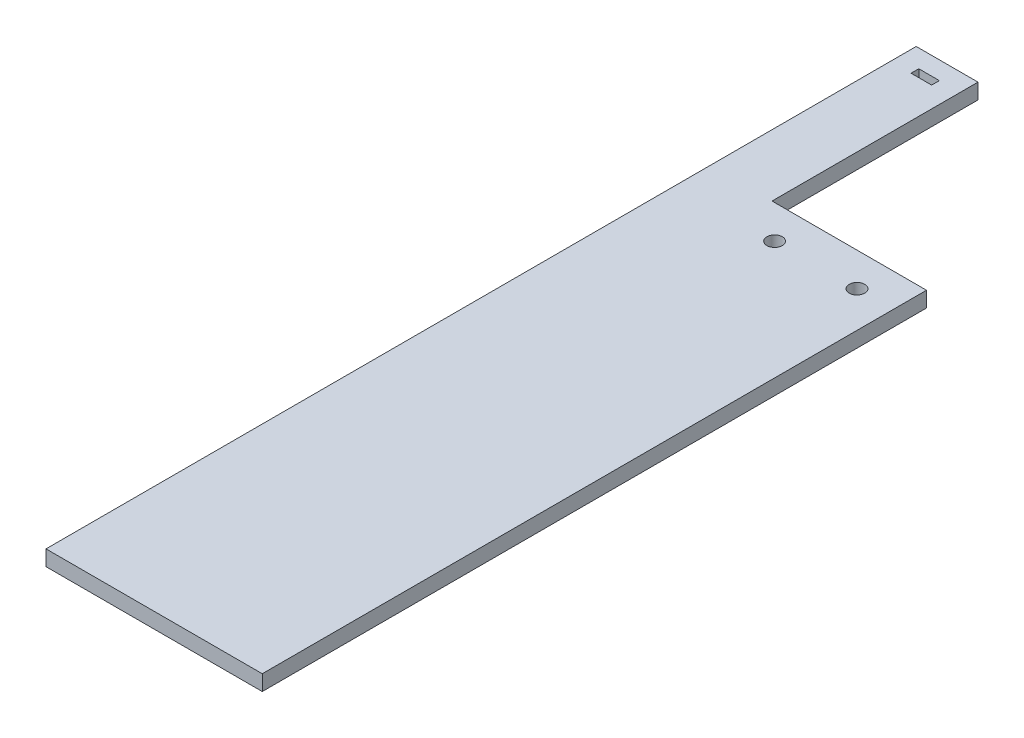
ISO-10303-21;
HEADER;
FILE_DESCRIPTION(('STEP AP214'),'2;1');
FILE_NAME('part.step','',(''),(''),'','','');
FILE_SCHEMA(('AUTOMOTIVE_DESIGN { 1 0 10303 214 1 1 1 1 }'));
ENDSEC;
DATA;
#1=APPLICATION_CONTEXT('core data for automotive mechanical design processes');
#2=APPLICATION_PROTOCOL_DEFINITION('international standard','automotive_design',2000,#1);
#3=PRODUCT_CONTEXT('',#1,'mechanical');
#4=PRODUCT('Part','Part','',(#3));
#5=PRODUCT_RELATED_PRODUCT_CATEGORY('part','',(#4));
#6=PRODUCT_DEFINITION_FORMATION('','',#4);
#7=PRODUCT_DEFINITION_CONTEXT('part definition',#1,'design');
#8=PRODUCT_DEFINITION('design','',#6,#7);
#9=PRODUCT_DEFINITION_SHAPE('','',#8);
#10=(LENGTH_UNIT() NAMED_UNIT(*) SI_UNIT(.MILLI.,.METRE.));
#11=(NAMED_UNIT(*) PLANE_ANGLE_UNIT() SI_UNIT($,.RADIAN.));
#12=(NAMED_UNIT(*) SI_UNIT($,.STERADIAN.) SOLID_ANGLE_UNIT());
#13=UNCERTAINTY_MEASURE_WITH_UNIT(LENGTH_MEASURE(1.E-05),#10,'distance_accuracy_value','');
#14=(GEOMETRIC_REPRESENTATION_CONTEXT(3) GLOBAL_UNCERTAINTY_ASSIGNED_CONTEXT((#13)) GLOBAL_UNIT_ASSIGNED_CONTEXT((#10,
#11,#12)) REPRESENTATION_CONTEXT('',''));
#15=CARTESIAN_POINT('',(0.,0.,0.));
#16=DIRECTION('',(0.,0.,1.));
#17=DIRECTION('',(1.,0.,0.));
#18=AXIS2_PLACEMENT_3D('',#15,#16,#17);
#19=CARTESIAN_POINT('',(0.,3.,0.));
#20=DIRECTION('',(0.,-1.,0.));
#21=DIRECTION('',(0.,0.,-1.));
#22=AXIS2_PLACEMENT_3D('',#19,#20,#21);
#23=PLANE('',#22);
#24=CARTESIAN_POINT('',(19.,3.,-122.5));
#25=DIRECTION('',(0.,1.,0.));
#26=DIRECTION('',(0.,0.,1.));
#27=AXIS2_PLACEMENT_3D('',#24,#25,#26);
#28=CIRCLE('',#27,1.5);
#29=CARTESIAN_POINT('',(19.,3.,-121.));
#30=VERTEX_POINT('',#29);
#31=EDGE_CURVE('E174',#30,#30,#28,.T.);
#32=ORIENTED_EDGE('',*,*,#31,.F.);
#33=EDGE_LOOP('',(#32));
#34=FACE_BOUND('',#33,.T.);
#35=DIRECTION('',(0.,0.,1.));
#36=VECTOR('',#35,1.);
#37=CARTESIAN_POINT('',(0.,3.,0.));
#38=LINE('',#37,#36);
#39=CARTESIAN_POINT('',(0.,3.,-169.));
#40=VERTEX_POINT('',#39);
#41=CARTESIAN_POINT('',(0.,3.,0.));
#42=VERTEX_POINT('',#41);
#43=EDGE_CURVE('E182',#40,#42,#38,.T.);
#44=ORIENTED_EDGE('',*,*,#43,.T.);
#45=DIRECTION('',(1.,0.,0.));
#46=VECTOR('',#45,1.);
#47=CARTESIAN_POINT('',(0.,3.,0.));
#48=LINE('',#47,#46);
#49=CARTESIAN_POINT('',(42.,3.,0.));
#50=VERTEX_POINT('',#49);
#51=EDGE_CURVE('E186',#42,#50,#48,.T.);
#52=ORIENTED_EDGE('',*,*,#51,.T.);
#53=DIRECTION('',(0.,0.,-1.));
#54=VECTOR('',#53,1.);
#55=CARTESIAN_POINT('',(42.,3.,0.));
#56=LINE('',#55,#54);
#57=CARTESIAN_POINT('',(42.,3.,-129.));
#58=VERTEX_POINT('',#57);
#59=EDGE_CURVE('E190',#50,#58,#56,.T.);
#60=ORIENTED_EDGE('',*,*,#59,.T.);
#61=DIRECTION('',(-1.,0.,0.));
#62=VECTOR('',#61,1.);
#63=CARTESIAN_POINT('',(12.,3.,-129.));
#64=LINE('',#63,#62);
#65=CARTESIAN_POINT('',(12.,3.,-129.));
#66=VERTEX_POINT('',#65);
#67=EDGE_CURVE('E193',#58,#66,#64,.T.);
#68=ORIENTED_EDGE('',*,*,#67,.T.);
#69=DIRECTION('',(0.,0.,-1.));
#70=VECTOR('',#69,1.);
#71=CARTESIAN_POINT('',(12.,3.,-169.));
#72=LINE('',#71,#70);
#73=CARTESIAN_POINT('',(12.,3.,-169.));
#74=VERTEX_POINT('',#73);
#75=EDGE_CURVE('E196',#66,#74,#72,.T.);
#76=ORIENTED_EDGE('',*,*,#75,.T.);
#77=DIRECTION('',(-1.,0.,0.));
#78=VECTOR('',#77,1.);
#79=CARTESIAN_POINT('',(0.,3.,-169.));
#80=LINE('',#79,#78);
#81=EDGE_CURVE('E199',#74,#40,#80,.T.);
#82=ORIENTED_EDGE('',*,*,#81,.T.);
#83=EDGE_LOOP('',(#44,#52,#60,#68,#76,#82));
#84=FACE_BOUND('',#83,.T.);
#85=DIRECTION('',(0.,0.,1.));
#86=VECTOR('',#85,1.);
#87=CARTESIAN_POINT('',(4.,3.,-165.5));
#88=LINE('',#87,#86);
#89=CARTESIAN_POINT('',(4.,3.,-165.5));
#90=VERTEX_POINT('',#89);
#91=CARTESIAN_POINT('',(4.,3.,-164.));
#92=VERTEX_POINT('',#91);
#93=EDGE_CURVE('E123',#90,#92,#88,.T.);
#94=ORIENTED_EDGE('',*,*,#93,.F.);
#95=DIRECTION('',(-1.,0.,0.));
#96=VECTOR('',#95,1.);
#97=CARTESIAN_POINT('',(4.,3.,-165.5));
#98=LINE('',#97,#96);
#99=CARTESIAN_POINT('',(8.,3.,-165.5));
#100=VERTEX_POINT('',#99);
#101=EDGE_CURVE('E150',#100,#90,#98,.T.);
#102=ORIENTED_EDGE('',*,*,#101,.F.);
#103=DIRECTION('',(0.,0.,-1.));
#104=VECTOR('',#103,1.);
#105=CARTESIAN_POINT('',(8.,3.,-165.5));
#106=LINE('',#105,#104);
#107=CARTESIAN_POINT('',(8.,3.,-164.));
#108=VERTEX_POINT('',#107);
#109=EDGE_CURVE('E146',#108,#100,#106,.T.);
#110=ORIENTED_EDGE('',*,*,#109,.F.);
#111=DIRECTION('',(1.,0.,0.));
#112=VECTOR('',#111,1.);
#113=CARTESIAN_POINT('',(4.,3.,-164.));
#114=LINE('',#113,#112);
#115=EDGE_CURVE('E132',#92,#108,#114,.T.);
#116=ORIENTED_EDGE('',*,*,#115,.F.);
#117=EDGE_LOOP('',(#94,#102,#110,#116));
#118=FACE_BOUND('',#117,.T.);
#119=CARTESIAN_POINT('',(35.,3.,-122.5));
#120=DIRECTION('',(0.,1.,0.));
#121=DIRECTION('',(0.,0.,1.));
#122=AXIS2_PLACEMENT_3D('',#119,#120,#121);
#123=CIRCLE('',#122,1.5);
#124=CARTESIAN_POINT('',(35.,3.,-121.));
#125=VERTEX_POINT('',#124);
#126=EDGE_CURVE('E158',#125,#125,#123,.T.);
#127=ORIENTED_EDGE('',*,*,#126,.F.);
#128=EDGE_LOOP('',(#127));
#129=FACE_BOUND('',#128,.T.);
#130=ADVANCED_FACE('F45',(#34,#84,#118,#129),#23,.F.);
#131=CARTESIAN_POINT('',(0.,0.,0.));
#132=DIRECTION('',(0.,-1.,0.));
#133=DIRECTION('',(0.,0.,-1.));
#134=AXIS2_PLACEMENT_3D('',#131,#132,#133);
#135=PLANE('',#134);
#136=DIRECTION('',(-1.,0.,0.));
#137=VECTOR('',#136,1.);
#138=CARTESIAN_POINT('',(4.,0.,-165.5));
#139=LINE('',#138,#137);
#140=CARTESIAN_POINT('',(8.,0.,-165.5));
#141=VERTEX_POINT('',#140);
#142=CARTESIAN_POINT('',(4.,0.,-165.5));
#143=VERTEX_POINT('',#142);
#144=EDGE_CURVE('E133',#141,#143,#139,.T.);
#145=ORIENTED_EDGE('',*,*,#144,.T.);
#146=DIRECTION('',(0.,0.,1.));
#147=VECTOR('',#146,1.);
#148=CARTESIAN_POINT('',(4.,0.,-165.5));
#149=LINE('',#148,#147);
#150=CARTESIAN_POINT('',(4.,0.,-164.));
#151=VERTEX_POINT('',#150);
#152=EDGE_CURVE('E69',#143,#151,#149,.T.);
#153=ORIENTED_EDGE('',*,*,#152,.T.);
#154=DIRECTION('',(1.,0.,0.));
#155=VECTOR('',#154,1.);
#156=CARTESIAN_POINT('',(4.,0.,-164.));
#157=LINE('',#156,#155);
#158=CARTESIAN_POINT('',(8.,0.,-164.));
#159=VERTEX_POINT('',#158);
#160=EDGE_CURVE('E139',#151,#159,#157,.T.);
#161=ORIENTED_EDGE('',*,*,#160,.T.);
#162=DIRECTION('',(0.,0.,-1.));
#163=VECTOR('',#162,1.);
#164=CARTESIAN_POINT('',(8.,0.,-165.5));
#165=LINE('',#164,#163);
#166=EDGE_CURVE('E161',#159,#141,#165,.T.);
#167=ORIENTED_EDGE('',*,*,#166,.T.);
#168=EDGE_LOOP('',(#145,#153,#161,#167));
#169=FACE_BOUND('',#168,.T.);
#170=CARTESIAN_POINT('',(19.,0.,-122.5));
#171=DIRECTION('',(0.,1.,0.));
#172=DIRECTION('',(0.,0.,1.));
#173=AXIS2_PLACEMENT_3D('',#170,#171,#172);
#174=CIRCLE('',#173,1.5);
#175=CARTESIAN_POINT('',(19.,0.,-121.));
#176=VERTEX_POINT('',#175);
#177=EDGE_CURVE('E141',#176,#176,#174,.T.);
#178=ORIENTED_EDGE('',*,*,#177,.T.);
#179=EDGE_LOOP('',(#178));
#180=FACE_BOUND('',#179,.T.);
#181=DIRECTION('',(1.,0.,0.));
#182=VECTOR('',#181,1.);
#183=CARTESIAN_POINT('',(0.,0.,0.));
#184=LINE('',#183,#182);
#185=CARTESIAN_POINT('',(0.,0.,0.));
#186=VERTEX_POINT('',#185);
#187=CARTESIAN_POINT('',(42.,0.,0.));
#188=VERTEX_POINT('',#187);
#189=EDGE_CURVE('E178',#186,#188,#184,.T.);
#190=ORIENTED_EDGE('',*,*,#189,.F.);
#191=DIRECTION('',(0.,0.,1.));
#192=VECTOR('',#191,1.);
#193=CARTESIAN_POINT('',(0.,0.,-129.));
#194=LINE('',#193,#192);
#195=CARTESIAN_POINT('',(0.,0.,-169.));
#196=VERTEX_POINT('',#195);
#197=EDGE_CURVE('E187',#196,#186,#194,.T.);
#198=ORIENTED_EDGE('',*,*,#197,.F.);
#199=DIRECTION('',(-1.,0.,0.));
#200=VECTOR('',#199,1.);
#201=CARTESIAN_POINT('',(0.,0.,-169.));
#202=LINE('',#201,#200);
#203=CARTESIAN_POINT('',(12.,0.,-169.));
#204=VERTEX_POINT('',#203);
#205=EDGE_CURVE('E215',#204,#196,#202,.T.);
#206=ORIENTED_EDGE('',*,*,#205,.F.);
#207=DIRECTION('',(0.,0.,-1.));
#208=VECTOR('',#207,1.);
#209=CARTESIAN_POINT('',(12.,0.,-169.));
#210=LINE('',#209,#208);
#211=CARTESIAN_POINT('',(12.,0.,-129.));
#212=VERTEX_POINT('',#211);
#213=EDGE_CURVE('E212',#212,#204,#210,.T.);
#214=ORIENTED_EDGE('',*,*,#213,.F.);
#215=DIRECTION('',(-1.,0.,0.));
#216=VECTOR('',#215,1.);
#217=CARTESIAN_POINT('',(12.,0.,-129.));
#218=LINE('',#217,#216);
#219=CARTESIAN_POINT('',(42.,0.,-129.));
#220=VERTEX_POINT('',#219);
#221=EDGE_CURVE('E209',#220,#212,#218,.T.);
#222=ORIENTED_EDGE('',*,*,#221,.F.);
#223=DIRECTION('',(0.,0.,-1.));
#224=VECTOR('',#223,1.);
#225=CARTESIAN_POINT('',(42.,0.,0.));
#226=LINE('',#225,#224);
#227=EDGE_CURVE('E206',#188,#220,#226,.T.);
#228=ORIENTED_EDGE('',*,*,#227,.F.);
#229=EDGE_LOOP('',(#190,#198,#206,#214,#222,#228));
#230=FACE_BOUND('',#229,.T.);
#231=CARTESIAN_POINT('',(35.,0.,-122.5));
#232=DIRECTION('',(0.,1.,0.));
#233=DIRECTION('',(0.,0.,1.));
#234=AXIS2_PLACEMENT_3D('',#231,#232,#233);
#235=CIRCLE('',#234,1.5);
#236=CARTESIAN_POINT('',(35.,0.,-121.));
#237=VERTEX_POINT('',#236);
#238=EDGE_CURVE('E310',#237,#237,#235,.T.);
#239=ORIENTED_EDGE('',*,*,#238,.T.);
#240=EDGE_LOOP('',(#239));
#241=FACE_BOUND('',#240,.T.);
#242=ADVANCED_FACE('F246',(#169,#180,#230,#241),#135,.T.);
#243=CARTESIAN_POINT('',(0.,3.,0.));
#244=DIRECTION('',(0.,0.,-1.));
#245=DIRECTION('',(-1.,0.,0.));
#246=AXIS2_PLACEMENT_3D('',#243,#244,#245);
#247=PLANE('',#246);
#248=ORIENTED_EDGE('',*,*,#189,.T.);
#249=DIRECTION('',(0.,-1.,0.));
#250=VECTOR('',#249,1.);
#251=CARTESIAN_POINT('',(42.,3.,0.));
#252=LINE('',#251,#250);
#253=EDGE_CURVE('E54',#50,#188,#252,.T.);
#254=ORIENTED_EDGE('',*,*,#253,.F.);
#255=ORIENTED_EDGE('',*,*,#51,.F.);
#256=DIRECTION('',(0.,-1.,0.));
#257=VECTOR('',#256,1.);
#258=CARTESIAN_POINT('',(0.,3.,0.));
#259=LINE('',#258,#257);
#260=EDGE_CURVE('E11',#42,#186,#259,.T.);
#261=ORIENTED_EDGE('',*,*,#260,.T.);
#262=EDGE_LOOP('',(#248,#254,#255,#261));
#263=FACE_BOUND('',#262,.T.);
#264=ADVANCED_FACE('F47',(#263),#247,.F.);
#265=CARTESIAN_POINT('',(42.,3.,0.));
#266=DIRECTION('',(-1.,0.,0.));
#267=DIRECTION('',(0.,0.,1.));
#268=AXIS2_PLACEMENT_3D('',#265,#266,#267);
#269=PLANE('',#268);
#270=ORIENTED_EDGE('',*,*,#227,.T.);
#271=DIRECTION('',(0.,-1.,0.));
#272=VECTOR('',#271,1.);
#273=CARTESIAN_POINT('',(42.,3.,-129.));
#274=LINE('',#273,#272);
#275=EDGE_CURVE('E231',#58,#220,#274,.T.);
#276=ORIENTED_EDGE('',*,*,#275,.F.);
#277=ORIENTED_EDGE('',*,*,#59,.F.);
#278=ORIENTED_EDGE('',*,*,#253,.T.);
#279=EDGE_LOOP('',(#270,#276,#277,#278));
#280=FACE_BOUND('',#279,.T.);
#281=ADVANCED_FACE('F240',(#280),#269,.F.);
#282=CARTESIAN_POINT('',(12.,3.,-129.));
#283=DIRECTION('',(0.,0.,1.));
#284=DIRECTION('',(1.,0.,0.));
#285=AXIS2_PLACEMENT_3D('',#282,#283,#284);
#286=PLANE('',#285);
#287=ORIENTED_EDGE('',*,*,#221,.T.);
#288=DIRECTION('',(0.,-1.,0.));
#289=VECTOR('',#288,1.);
#290=CARTESIAN_POINT('',(12.,3.,-129.));
#291=LINE('',#290,#289);
#292=EDGE_CURVE('E227',#66,#212,#291,.T.);
#293=ORIENTED_EDGE('',*,*,#292,.F.);
#294=ORIENTED_EDGE('',*,*,#67,.F.);
#295=ORIENTED_EDGE('',*,*,#275,.T.);
#296=EDGE_LOOP('',(#287,#293,#294,#295));
#297=FACE_BOUND('',#296,.T.);
#298=ADVANCED_FACE('F253',(#297),#286,.F.);
#299=CARTESIAN_POINT('',(12.,3.,-169.));
#300=DIRECTION('',(-1.,0.,0.));
#301=DIRECTION('',(0.,0.,1.));
#302=AXIS2_PLACEMENT_3D('',#299,#300,#301);
#303=PLANE('',#302);
#304=ORIENTED_EDGE('',*,*,#213,.T.);
#305=DIRECTION('',(0.,-1.,0.));
#306=VECTOR('',#305,1.);
#307=CARTESIAN_POINT('',(12.,3.,-169.));
#308=LINE('',#307,#306);
#309=EDGE_CURVE('E223',#74,#204,#308,.T.);
#310=ORIENTED_EDGE('',*,*,#309,.F.);
#311=ORIENTED_EDGE('',*,*,#75,.F.);
#312=ORIENTED_EDGE('',*,*,#292,.T.);
#313=EDGE_LOOP('',(#304,#310,#311,#312));
#314=FACE_BOUND('',#313,.T.);
#315=ADVANCED_FACE('F257',(#314),#303,.F.);
#316=CARTESIAN_POINT('',(0.,3.,-169.));
#317=DIRECTION('',(0.,0.,1.));
#318=DIRECTION('',(1.,0.,0.));
#319=AXIS2_PLACEMENT_3D('',#316,#317,#318);
#320=PLANE('',#319);
#321=ORIENTED_EDGE('',*,*,#205,.T.);
#322=DIRECTION('',(0.,-1.,0.));
#323=VECTOR('',#322,1.);
#324=CARTESIAN_POINT('',(0.,3.,-169.));
#325=LINE('',#324,#323);
#326=EDGE_CURVE('E203',#40,#196,#325,.T.);
#327=ORIENTED_EDGE('',*,*,#326,.F.);
#328=ORIENTED_EDGE('',*,*,#81,.F.);
#329=ORIENTED_EDGE('',*,*,#309,.T.);
#330=EDGE_LOOP('',(#321,#327,#328,#329));
#331=FACE_BOUND('',#330,.T.);
#332=ADVANCED_FACE('F266',(#331),#320,.F.);
#333=CARTESIAN_POINT('',(0.,3.,-129.));
#334=DIRECTION('',(1.,0.,0.));
#335=DIRECTION('',(0.,0.,-1.));
#336=AXIS2_PLACEMENT_3D('',#333,#334,#335);
#337=PLANE('',#336);
#338=ORIENTED_EDGE('',*,*,#197,.T.);
#339=ORIENTED_EDGE('',*,*,#260,.F.);
#340=ORIENTED_EDGE('',*,*,#43,.F.);
#341=ORIENTED_EDGE('',*,*,#326,.T.);
#342=EDGE_LOOP('',(#338,#339,#340,#341));
#343=FACE_BOUND('',#342,.T.);
#344=ADVANCED_FACE('F264',(#343),#337,.F.);
#345=CARTESIAN_POINT('',(19.,3.,-122.5));
#346=DIRECTION('',(0.,-1.,0.));
#347=DIRECTION('',(0.,0.,-1.));
#348=AXIS2_PLACEMENT_3D('',#345,#346,#347);
#349=CYLINDRICAL_SURFACE('',#348,1.5);
#350=ORIENTED_EDGE('',*,*,#31,.T.);
#351=EDGE_LOOP('',(#350));
#352=FACE_BOUND('',#351,.T.);
#353=ORIENTED_EDGE('',*,*,#177,.F.);
#354=EDGE_LOOP('',(#353));
#355=FACE_BOUND('',#354,.T.);
#356=ADVANCED_FACE('F273',(#352,#355),#349,.F.);
#357=CARTESIAN_POINT('',(4.,3.,-165.5));
#358=DIRECTION('',(1.,0.,0.));
#359=DIRECTION('',(0.,0.,-1.));
#360=AXIS2_PLACEMENT_3D('',#357,#358,#359);
#361=PLANE('',#360);
#362=ORIENTED_EDGE('',*,*,#152,.F.);
#363=DIRECTION('',(0.,-1.,0.));
#364=VECTOR('',#363,1.);
#365=CARTESIAN_POINT('',(4.,3.,-165.5));
#366=LINE('',#365,#364);
#367=EDGE_CURVE('E127',#90,#143,#366,.T.);
#368=ORIENTED_EDGE('',*,*,#367,.F.);
#369=ORIENTED_EDGE('',*,*,#93,.T.);
#370=DIRECTION('',(0.,-1.,0.));
#371=VECTOR('',#370,1.);
#372=CARTESIAN_POINT('',(4.,3.,-164.));
#373=LINE('',#372,#371);
#374=EDGE_CURVE('E126',#92,#151,#373,.T.);
#375=ORIENTED_EDGE('',*,*,#374,.T.);
#376=EDGE_LOOP('',(#362,#368,#369,#375));
#377=FACE_BOUND('',#376,.T.);
#378=ADVANCED_FACE('F125',(#377),#361,.T.);
#379=CARTESIAN_POINT('',(4.,3.,-164.));
#380=DIRECTION('',(0.,0.,-1.));
#381=DIRECTION('',(-1.,0.,0.));
#382=AXIS2_PLACEMENT_3D('',#379,#380,#381);
#383=PLANE('',#382);
#384=ORIENTED_EDGE('',*,*,#160,.F.);
#385=ORIENTED_EDGE('',*,*,#374,.F.);
#386=ORIENTED_EDGE('',*,*,#115,.T.);
#387=DIRECTION('',(0.,-1.,0.));
#388=VECTOR('',#387,1.);
#389=CARTESIAN_POINT('',(8.,3.,-164.));
#390=LINE('',#389,#388);
#391=EDGE_CURVE('E142',#108,#159,#390,.T.);
#392=ORIENTED_EDGE('',*,*,#391,.T.);
#393=EDGE_LOOP('',(#384,#385,#386,#392));
#394=FACE_BOUND('',#393,.T.);
#395=ADVANCED_FACE('F136',(#394),#383,.T.);
#396=CARTESIAN_POINT('',(8.,3.,-165.5));
#397=DIRECTION('',(-1.,0.,0.));
#398=DIRECTION('',(0.,0.,1.));
#399=AXIS2_PLACEMENT_3D('',#396,#397,#398);
#400=PLANE('',#399);
#401=ORIENTED_EDGE('',*,*,#166,.F.);
#402=ORIENTED_EDGE('',*,*,#391,.F.);
#403=ORIENTED_EDGE('',*,*,#109,.T.);
#404=DIRECTION('',(0.,-1.,0.));
#405=VECTOR('',#404,1.);
#406=CARTESIAN_POINT('',(8.,3.,-165.5));
#407=LINE('',#406,#405);
#408=EDGE_CURVE('E61',#100,#141,#407,.T.);
#409=ORIENTED_EDGE('',*,*,#408,.T.);
#410=EDGE_LOOP('',(#401,#402,#403,#409));
#411=FACE_BOUND('',#410,.T.);
#412=ADVANCED_FACE('F293',(#411),#400,.T.);
#413=CARTESIAN_POINT('',(4.,3.,-165.5));
#414=DIRECTION('',(0.,0.,1.));
#415=DIRECTION('',(1.,0.,0.));
#416=AXIS2_PLACEMENT_3D('',#413,#414,#415);
#417=PLANE('',#416);
#418=ORIENTED_EDGE('',*,*,#144,.F.);
#419=ORIENTED_EDGE('',*,*,#408,.F.);
#420=ORIENTED_EDGE('',*,*,#101,.T.);
#421=ORIENTED_EDGE('',*,*,#367,.T.);
#422=EDGE_LOOP('',(#418,#419,#420,#421));
#423=FACE_BOUND('',#422,.T.);
#424=ADVANCED_FACE('F296',(#423),#417,.T.);
#425=CARTESIAN_POINT('',(35.,3.,-122.5));
#426=DIRECTION('',(0.,-1.,0.));
#427=DIRECTION('',(0.,0.,-1.));
#428=AXIS2_PLACEMENT_3D('',#425,#426,#427);
#429=CYLINDRICAL_SURFACE('',#428,1.5);
#430=ORIENTED_EDGE('',*,*,#126,.T.);
#431=EDGE_LOOP('',(#430));
#432=FACE_BOUND('',#431,.T.);
#433=ORIENTED_EDGE('',*,*,#238,.F.);
#434=EDGE_LOOP('',(#433));
#435=FACE_BOUND('',#434,.T.);
#436=ADVANCED_FACE('F300',(#432,#435),#429,.F.);
#437=CLOSED_SHELL('',(#130,#242,#264,#281,#298,#315,#332,#344,#356,#378,#395,#412,#424,#436));
#438=MANIFOLD_SOLID_BREP('B2',#437);
#439=ADVANCED_BREP_SHAPE_REPRESENTATION('',(#18,#438),#14);
#440=SHAPE_DEFINITION_REPRESENTATION(#9,#439);
ENDSEC;
END-ISO-10303-21;
